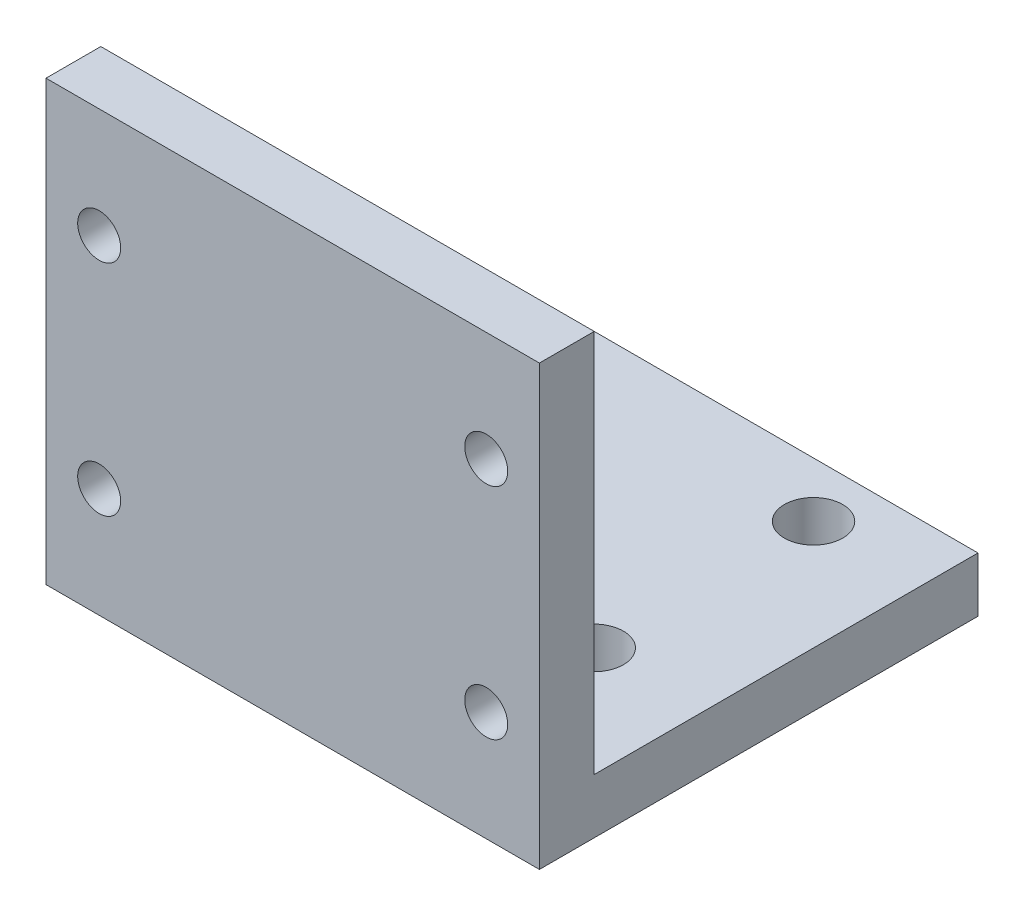
ISO-10303-21;
HEADER;
FILE_DESCRIPTION(('STEP AP214'),'2;1');
FILE_NAME('part.step','',(''),(''),'','','');
FILE_SCHEMA(('AUTOMOTIVE_DESIGN { 1 0 10303 214 1 1 1 1 }'));
ENDSEC;
DATA;
#1=APPLICATION_CONTEXT('core data for automotive mechanical design processes');
#2=APPLICATION_PROTOCOL_DEFINITION('international standard','automotive_design',2000,#1);
#3=PRODUCT_CONTEXT('',#1,'mechanical');
#4=PRODUCT('Part','Part','',(#3));
#5=PRODUCT_RELATED_PRODUCT_CATEGORY('part','',(#4));
#6=PRODUCT_DEFINITION_FORMATION('','',#4);
#7=PRODUCT_DEFINITION_CONTEXT('part definition',#1,'design');
#8=PRODUCT_DEFINITION('design','',#6,#7);
#9=PRODUCT_DEFINITION_SHAPE('','',#8);
#10=(LENGTH_UNIT() NAMED_UNIT(*) SI_UNIT(.MILLI.,.METRE.));
#11=(NAMED_UNIT(*) PLANE_ANGLE_UNIT() SI_UNIT($,.RADIAN.));
#12=(NAMED_UNIT(*) SI_UNIT($,.STERADIAN.) SOLID_ANGLE_UNIT());
#13=UNCERTAINTY_MEASURE_WITH_UNIT(LENGTH_MEASURE(1.E-05),#10,'distance_accuracy_value','');
#14=(GEOMETRIC_REPRESENTATION_CONTEXT(3) GLOBAL_UNCERTAINTY_ASSIGNED_CONTEXT((#13)) GLOBAL_UNIT_ASSIGNED_CONTEXT((#10,
#11,#12)) REPRESENTATION_CONTEXT('',''));
#15=CARTESIAN_POINT('',(0.,0.,0.));
#16=DIRECTION('',(0.,0.,1.));
#17=DIRECTION('',(1.,0.,0.));
#18=AXIS2_PLACEMENT_3D('',#15,#16,#17);
#19=CARTESIAN_POINT('',(57.15,0.,-50.8));
#20=DIRECTION('',(0.,1.,0.));
#21=DIRECTION('',(0.,0.,1.));
#22=AXIS2_PLACEMENT_3D('',#19,#20,#21);
#23=PLANE('',#22);
#24=CARTESIAN_POINT('',(44.45,0.,-19.05));
#25=DIRECTION('',(0.,1.,0.));
#26=DIRECTION('',(0.,0.,1.));
#27=AXIS2_PLACEMENT_3D('',#24,#25,#26);
#28=CIRCLE('',#27,3.3782);
#29=CARTESIAN_POINT('',(44.45,0.,-15.6718));
#30=VERTEX_POINT('',#29);
#31=EDGE_CURVE('E163',#30,#30,#28,.T.);
#32=ORIENTED_EDGE('',*,*,#31,.T.);
#33=EDGE_LOOP('',(#32));
#34=FACE_BOUND('',#33,.T.);
#35=CARTESIAN_POINT('',(44.45,0.,-44.45));
#36=DIRECTION('',(0.,1.,0.));
#37=DIRECTION('',(0.,0.,1.));
#38=AXIS2_PLACEMENT_3D('',#35,#36,#37);
#39=CIRCLE('',#38,3.3782);
#40=CARTESIAN_POINT('',(44.45,0.,-41.0718));
#41=VERTEX_POINT('',#40);
#42=EDGE_CURVE('E167',#41,#41,#39,.T.);
#43=ORIENTED_EDGE('',*,*,#42,.T.);
#44=EDGE_LOOP('',(#43));
#45=FACE_BOUND('',#44,.T.);
#46=CARTESIAN_POINT('',(12.7,0.,-44.45));
#47=DIRECTION('',(0.,1.,0.));
#48=DIRECTION('',(0.,0.,1.));
#49=AXIS2_PLACEMENT_3D('',#46,#47,#48);
#50=CIRCLE('',#49,3.3782);
#51=CARTESIAN_POINT('',(12.7,0.,-41.0718));
#52=VERTEX_POINT('',#51);
#53=EDGE_CURVE('E171',#52,#52,#50,.T.);
#54=ORIENTED_EDGE('',*,*,#53,.T.);
#55=EDGE_LOOP('',(#54));
#56=FACE_BOUND('',#55,.T.);
#57=CARTESIAN_POINT('',(12.7,0.,-19.05));
#58=DIRECTION('',(0.,1.,0.));
#59=DIRECTION('',(0.,0.,1.));
#60=AXIS2_PLACEMENT_3D('',#57,#58,#59);
#61=CIRCLE('',#60,3.3782);
#62=CARTESIAN_POINT('',(12.7,0.,-15.6718));
#63=VERTEX_POINT('',#62);
#64=EDGE_CURVE('E174',#63,#63,#61,.T.);
#65=ORIENTED_EDGE('',*,*,#64,.T.);
#66=EDGE_LOOP('',(#65));
#67=FACE_BOUND('',#66,.T.);
#68=DIRECTION('',(0.,0.,-1.));
#69=VECTOR('',#68,1.);
#70=CARTESIAN_POINT('',(0.,0.,-50.8));
#71=LINE('',#70,#69);
#72=CARTESIAN_POINT('',(0.,0.,0.));
#73=VERTEX_POINT('',#72);
#74=CARTESIAN_POINT('',(0.,0.,-50.8));
#75=VERTEX_POINT('',#74);
#76=EDGE_CURVE('E117',#73,#75,#71,.T.);
#77=ORIENTED_EDGE('',*,*,#76,.T.);
#78=DIRECTION('',(-1.,0.,0.));
#79=VECTOR('',#78,1.);
#80=CARTESIAN_POINT('',(57.15,0.,-50.8));
#81=LINE('',#80,#79);
#82=CARTESIAN_POINT('',(57.15,0.,-50.8));
#83=VERTEX_POINT('',#82);
#84=EDGE_CURVE('E11',#83,#75,#81,.T.);
#85=ORIENTED_EDGE('',*,*,#84,.F.);
#86=DIRECTION('',(0.,0.,-1.));
#87=VECTOR('',#86,1.);
#88=CARTESIAN_POINT('',(57.15,0.,-50.8));
#89=LINE('',#88,#87);
#90=CARTESIAN_POINT('',(57.15,0.,0.));
#91=VERTEX_POINT('',#90);
#92=EDGE_CURVE('E128',#91,#83,#89,.T.);
#93=ORIENTED_EDGE('',*,*,#92,.F.);
#94=DIRECTION('',(-1.,0.,0.));
#95=VECTOR('',#94,1.);
#96=CARTESIAN_POINT('',(57.15,0.,0.));
#97=LINE('',#96,#95);
#98=EDGE_CURVE('E113',#91,#73,#97,.T.);
#99=ORIENTED_EDGE('',*,*,#98,.T.);
#100=EDGE_LOOP('',(#77,#85,#93,#99));
#101=FACE_BOUND('',#100,.T.);
#102=ADVANCED_FACE('F33',(#34,#45,#56,#67,#101),#23,.F.);
#103=CARTESIAN_POINT('',(57.15,6.34999999999999,-50.8));
#104=DIRECTION('',(0.,0.,1.));
#105=DIRECTION('',(1.,0.,0.));
#106=AXIS2_PLACEMENT_3D('',#103,#104,#105);
#107=PLANE('',#106);
#108=DIRECTION('',(0.,1.,0.));
#109=VECTOR('',#108,1.);
#110=CARTESIAN_POINT('',(0.,6.34999999999999,-50.8));
#111=LINE('',#110,#109);
#112=CARTESIAN_POINT('',(0.,6.34999999999999,-50.8));
#113=VERTEX_POINT('',#112);
#114=EDGE_CURVE('E120',#75,#113,#111,.T.);
#115=ORIENTED_EDGE('',*,*,#114,.T.);
#116=DIRECTION('',(-1.,0.,0.));
#117=VECTOR('',#116,1.);
#118=CARTESIAN_POINT('',(57.15,6.34999999999999,-50.8));
#119=LINE('',#118,#117);
#120=CARTESIAN_POINT('',(57.15,6.34999999999999,-50.8));
#121=VERTEX_POINT('',#120);
#122=EDGE_CURVE('E41',#121,#113,#119,.T.);
#123=ORIENTED_EDGE('',*,*,#122,.F.);
#124=DIRECTION('',(0.,1.,0.));
#125=VECTOR('',#124,1.);
#126=CARTESIAN_POINT('',(57.15,6.34999999999999,-50.8));
#127=LINE('',#126,#125);
#128=EDGE_CURVE('E86',#83,#121,#127,.T.);
#129=ORIENTED_EDGE('',*,*,#128,.F.);
#130=ORIENTED_EDGE('',*,*,#84,.T.);
#131=EDGE_LOOP('',(#115,#123,#129,#130));
#132=FACE_BOUND('',#131,.T.);
#133=ADVANCED_FACE('F155',(#132),#107,.F.);
#134=CARTESIAN_POINT('',(57.15,6.35,-6.35000000000001));
#135=DIRECTION('',(0.,-1.,0.));
#136=DIRECTION('',(0.,0.,-1.));
#137=AXIS2_PLACEMENT_3D('',#134,#135,#136);
#138=PLANE('',#137);
#139=CARTESIAN_POINT('',(44.45,6.35,-19.05));
#140=DIRECTION('',(0.,1.,0.));
#141=DIRECTION('',(0.,0.,1.));
#142=AXIS2_PLACEMENT_3D('',#139,#140,#141);
#143=CIRCLE('',#142,3.3782);
#144=CARTESIAN_POINT('',(44.45,6.35,-15.6718));
#145=VERTEX_POINT('',#144);
#146=EDGE_CURVE('E250',#145,#145,#143,.T.);
#147=ORIENTED_EDGE('',*,*,#146,.F.);
#148=EDGE_LOOP('',(#147));
#149=FACE_BOUND('',#148,.T.);
#150=CARTESIAN_POINT('',(44.45,6.34999999999999,-44.45));
#151=DIRECTION('',(0.,1.,0.));
#152=DIRECTION('',(0.,0.,1.));
#153=AXIS2_PLACEMENT_3D('',#150,#151,#152);
#154=CIRCLE('',#153,3.3782);
#155=CARTESIAN_POINT('',(44.45,6.34999999999999,-41.0718));
#156=VERTEX_POINT('',#155);
#157=EDGE_CURVE('E253',#156,#156,#154,.T.);
#158=ORIENTED_EDGE('',*,*,#157,.F.);
#159=EDGE_LOOP('',(#158));
#160=FACE_BOUND('',#159,.T.);
#161=CARTESIAN_POINT('',(12.7,6.34999999999999,-44.45));
#162=DIRECTION('',(0.,1.,0.));
#163=DIRECTION('',(0.,0.,1.));
#164=AXIS2_PLACEMENT_3D('',#161,#162,#163);
#165=CIRCLE('',#164,3.3782);
#166=CARTESIAN_POINT('',(12.7,6.34999999999999,-41.0718));
#167=VERTEX_POINT('',#166);
#168=EDGE_CURVE('E185',#167,#167,#165,.T.);
#169=ORIENTED_EDGE('',*,*,#168,.F.);
#170=EDGE_LOOP('',(#169));
#171=FACE_BOUND('',#170,.T.);
#172=CARTESIAN_POINT('',(12.7,6.35,-19.05));
#173=DIRECTION('',(0.,1.,0.));
#174=DIRECTION('',(0.,0.,1.));
#175=AXIS2_PLACEMENT_3D('',#172,#173,#174);
#176=CIRCLE('',#175,3.3782);
#177=CARTESIAN_POINT('',(12.7,6.35,-15.6718));
#178=VERTEX_POINT('',#177);
#179=EDGE_CURVE('E177',#178,#178,#176,.T.);
#180=ORIENTED_EDGE('',*,*,#179,.F.);
#181=EDGE_LOOP('',(#180));
#182=FACE_BOUND('',#181,.T.);
#183=DIRECTION('',(0.,0.,1.));
#184=VECTOR('',#183,1.);
#185=CARTESIAN_POINT('',(0.,6.35,-6.35000000000001));
#186=LINE('',#185,#184);
#187=CARTESIAN_POINT('',(0.,6.35,-6.35000000000001));
#188=VERTEX_POINT('',#187);
#189=EDGE_CURVE('E123',#113,#188,#186,.T.);
#190=ORIENTED_EDGE('',*,*,#189,.T.);
#191=DIRECTION('',(-1.,0.,0.));
#192=VECTOR('',#191,1.);
#193=CARTESIAN_POINT('',(57.15,6.35,-6.35000000000001));
#194=LINE('',#193,#192);
#195=CARTESIAN_POINT('',(57.15,6.35,-6.35000000000001));
#196=VERTEX_POINT('',#195);
#197=EDGE_CURVE('E108',#196,#188,#194,.T.);
#198=ORIENTED_EDGE('',*,*,#197,.F.);
#199=DIRECTION('',(0.,0.,1.));
#200=VECTOR('',#199,1.);
#201=CARTESIAN_POINT('',(57.15,6.35,-6.35000000000001));
#202=LINE('',#201,#200);
#203=EDGE_CURVE('E99',#121,#196,#202,.T.);
#204=ORIENTED_EDGE('',*,*,#203,.F.);
#205=ORIENTED_EDGE('',*,*,#122,.T.);
#206=EDGE_LOOP('',(#190,#198,#204,#205));
#207=FACE_BOUND('',#206,.T.);
#208=ADVANCED_FACE('F134',(#149,#160,#171,#182,#207),#138,.F.);
#209=CARTESIAN_POINT('',(57.15,50.8,-6.34999999999999));
#210=DIRECTION('',(0.,0.,1.));
#211=DIRECTION('',(0.,-1.,0.));
#212=AXIS2_PLACEMENT_3D('',#209,#210,#211);
#213=PLANE('',#212);
#214=CARTESIAN_POINT('',(6.15950000000001,12.7,-6.35000000000001));
#215=DIRECTION('',(0.,0.,1.));
#216=DIRECTION('',(0.,-1.,0.));
#217=AXIS2_PLACEMENT_3D('',#214,#215,#216);
#218=CIRCLE('',#217,2.4892);
#219=CARTESIAN_POINT('',(6.15950000000001,10.2108,-6.35000000000001));
#220=VERTEX_POINT('',#219);
#221=EDGE_CURVE('E180',#220,#220,#218,.T.);
#222=ORIENTED_EDGE('',*,*,#221,.T.);
#223=EDGE_LOOP('',(#222));
#224=FACE_BOUND('',#223,.T.);
#225=CARTESIAN_POINT('',(50.9905,12.7,-6.35000000000001));
#226=DIRECTION('',(0.,0.,1.));
#227=DIRECTION('',(0.,-1.,0.));
#228=AXIS2_PLACEMENT_3D('',#225,#226,#227);
#229=CIRCLE('',#228,2.4892);
#230=CARTESIAN_POINT('',(50.9905,10.2108,-6.35000000000001));
#231=VERTEX_POINT('',#230);
#232=EDGE_CURVE('E193',#231,#231,#229,.T.);
#233=ORIENTED_EDGE('',*,*,#232,.T.);
#234=EDGE_LOOP('',(#233));
#235=FACE_BOUND('',#234,.T.);
#236=CARTESIAN_POINT('',(50.9905,38.1,-6.35));
#237=DIRECTION('',(0.,0.,1.));
#238=DIRECTION('',(0.,-1.,0.));
#239=AXIS2_PLACEMENT_3D('',#236,#237,#238);
#240=CIRCLE('',#239,2.4892);
#241=CARTESIAN_POINT('',(50.9905,35.6108,-6.35));
#242=VERTEX_POINT('',#241);
#243=EDGE_CURVE('E199',#242,#242,#240,.T.);
#244=ORIENTED_EDGE('',*,*,#243,.T.);
#245=EDGE_LOOP('',(#244));
#246=FACE_BOUND('',#245,.T.);
#247=CARTESIAN_POINT('',(6.1595,38.1,-6.35));
#248=DIRECTION('',(0.,0.,1.));
#249=DIRECTION('',(0.,-1.,0.));
#250=AXIS2_PLACEMENT_3D('',#247,#248,#249);
#251=CIRCLE('',#250,2.4892);
#252=CARTESIAN_POINT('',(6.1595,35.6108,-6.35));
#253=VERTEX_POINT('',#252);
#254=EDGE_CURVE('E121',#253,#253,#251,.T.);
#255=ORIENTED_EDGE('',*,*,#254,.T.);
#256=EDGE_LOOP('',(#255));
#257=FACE_BOUND('',#256,.T.);
#258=DIRECTION('',(0.,1.,0.));
#259=VECTOR('',#258,1.);
#260=CARTESIAN_POINT('',(0.,50.8,-6.34999999999999));
#261=LINE('',#260,#259);
#262=CARTESIAN_POINT('',(0.,50.8,-6.34999999999999));
#263=VERTEX_POINT('',#262);
#264=EDGE_CURVE('E107',#188,#263,#261,.T.);
#265=ORIENTED_EDGE('',*,*,#264,.T.);
#266=DIRECTION('',(-1.,0.,0.));
#267=VECTOR('',#266,1.);
#268=CARTESIAN_POINT('',(57.15,50.8,-6.34999999999999));
#269=LINE('',#268,#267);
#270=CARTESIAN_POINT('',(57.15,50.8,-6.34999999999999));
#271=VERTEX_POINT('',#270);
#272=EDGE_CURVE('E104',#271,#263,#269,.T.);
#273=ORIENTED_EDGE('',*,*,#272,.F.);
#274=DIRECTION('',(0.,1.,0.));
#275=VECTOR('',#274,1.);
#276=CARTESIAN_POINT('',(57.15,50.8,-6.34999999999999));
#277=LINE('',#276,#275);
#278=EDGE_CURVE('E93',#196,#271,#277,.T.);
#279=ORIENTED_EDGE('',*,*,#278,.F.);
#280=ORIENTED_EDGE('',*,*,#197,.T.);
#281=EDGE_LOOP('',(#265,#273,#279,#280));
#282=FACE_BOUND('',#281,.T.);
#283=ADVANCED_FACE('F105',(#224,#235,#246,#257,#282),#213,.F.);
#284=CARTESIAN_POINT('',(57.15,50.8,0.));
#285=DIRECTION('',(0.,-1.,0.));
#286=DIRECTION('',(0.,0.,-1.));
#287=AXIS2_PLACEMENT_3D('',#284,#285,#286);
#288=PLANE('',#287);
#289=DIRECTION('',(0.,0.,1.));
#290=VECTOR('',#289,1.);
#291=CARTESIAN_POINT('',(0.,50.8,0.));
#292=LINE('',#291,#290);
#293=CARTESIAN_POINT('',(0.,50.8,0.));
#294=VERTEX_POINT('',#293);
#295=EDGE_CURVE('E72',#263,#294,#292,.T.);
#296=ORIENTED_EDGE('',*,*,#295,.T.);
#297=DIRECTION('',(-1.,0.,0.));
#298=VECTOR('',#297,1.);
#299=CARTESIAN_POINT('',(57.15,50.8,0.));
#300=LINE('',#299,#298);
#301=CARTESIAN_POINT('',(57.15,50.8,0.));
#302=VERTEX_POINT('',#301);
#303=EDGE_CURVE('E109',#302,#294,#300,.T.);
#304=ORIENTED_EDGE('',*,*,#303,.F.);
#305=DIRECTION('',(0.,0.,1.));
#306=VECTOR('',#305,1.);
#307=CARTESIAN_POINT('',(57.15,50.8,0.));
#308=LINE('',#307,#306);
#309=EDGE_CURVE('E97',#271,#302,#308,.T.);
#310=ORIENTED_EDGE('',*,*,#309,.F.);
#311=ORIENTED_EDGE('',*,*,#272,.T.);
#312=EDGE_LOOP('',(#296,#304,#310,#311));
#313=FACE_BOUND('',#312,.T.);
#314=ADVANCED_FACE('F111',(#313),#288,.F.);
#315=CARTESIAN_POINT('',(57.15,0.,0.));
#316=DIRECTION('',(0.,0.,-1.));
#317=DIRECTION('',(0.,1.,0.));
#318=AXIS2_PLACEMENT_3D('',#315,#316,#317);
#319=PLANE('',#318);
#320=CARTESIAN_POINT('',(6.15950000000001,12.7,0.));
#321=DIRECTION('',(0.,0.,1.));
#322=DIRECTION('',(1.,0.,0.));
#323=AXIS2_PLACEMENT_3D('',#320,#321,#322);
#324=CIRCLE('',#323,2.4892);
#325=CARTESIAN_POINT('',(8.64870000000001,12.7,0.));
#326=VERTEX_POINT('',#325);
#327=EDGE_CURVE('E176',#326,#326,#324,.T.);
#328=ORIENTED_EDGE('',*,*,#327,.F.);
#329=EDGE_LOOP('',(#328));
#330=FACE_BOUND('',#329,.T.);
#331=CARTESIAN_POINT('',(50.9905,12.7,0.));
#332=DIRECTION('',(0.,0.,1.));
#333=DIRECTION('',(1.,0.,0.));
#334=AXIS2_PLACEMENT_3D('',#331,#332,#333);
#335=CIRCLE('',#334,2.4892);
#336=CARTESIAN_POINT('',(53.4797,12.7,0.));
#337=VERTEX_POINT('',#336);
#338=EDGE_CURVE('E190',#337,#337,#335,.T.);
#339=ORIENTED_EDGE('',*,*,#338,.F.);
#340=EDGE_LOOP('',(#339));
#341=FACE_BOUND('',#340,.T.);
#342=CARTESIAN_POINT('',(50.9905,38.1,0.));
#343=DIRECTION('',(0.,0.,1.));
#344=DIRECTION('',(1.,0.,0.));
#345=AXIS2_PLACEMENT_3D('',#342,#343,#344);
#346=CIRCLE('',#345,2.4892);
#347=CARTESIAN_POINT('',(53.4797,38.1,0.));
#348=VERTEX_POINT('',#347);
#349=EDGE_CURVE('E196',#348,#348,#346,.T.);
#350=ORIENTED_EDGE('',*,*,#349,.F.);
#351=EDGE_LOOP('',(#350));
#352=FACE_BOUND('',#351,.T.);
#353=CARTESIAN_POINT('',(6.1595,38.1,0.));
#354=DIRECTION('',(0.,0.,1.));
#355=DIRECTION('',(1.,0.,0.));
#356=AXIS2_PLACEMENT_3D('',#353,#354,#355);
#357=CIRCLE('',#356,2.4892);
#358=CARTESIAN_POINT('',(8.64870000000001,38.1,0.));
#359=VERTEX_POINT('',#358);
#360=EDGE_CURVE('E202',#359,#359,#357,.T.);
#361=ORIENTED_EDGE('',*,*,#360,.F.);
#362=EDGE_LOOP('',(#361));
#363=FACE_BOUND('',#362,.T.);
#364=DIRECTION('',(0.,-1.,0.));
#365=VECTOR('',#364,1.);
#366=CARTESIAN_POINT('',(0.,0.,0.));
#367=LINE('',#366,#365);
#368=EDGE_CURVE('E78',#294,#73,#367,.T.);
#369=ORIENTED_EDGE('',*,*,#368,.T.);
#370=ORIENTED_EDGE('',*,*,#98,.F.);
#371=DIRECTION('',(0.,-1.,0.));
#372=VECTOR('',#371,1.);
#373=CARTESIAN_POINT('',(57.15,0.,0.));
#374=LINE('',#373,#372);
#375=EDGE_CURVE('E49',#302,#91,#374,.T.);
#376=ORIENTED_EDGE('',*,*,#375,.F.);
#377=ORIENTED_EDGE('',*,*,#303,.T.);
#378=EDGE_LOOP('',(#369,#370,#376,#377));
#379=FACE_BOUND('',#378,.T.);
#380=ADVANCED_FACE('F141',(#330,#341,#352,#363,#379),#319,.F.);
#381=CARTESIAN_POINT('',(57.15,0.,0.));
#382=DIRECTION('',(-1.,0.,0.));
#383=DIRECTION('',(0.,0.,1.));
#384=AXIS2_PLACEMENT_3D('',#381,#382,#383);
#385=PLANE('',#384);
#386=ORIENTED_EDGE('',*,*,#92,.T.);
#387=ORIENTED_EDGE('',*,*,#128,.T.);
#388=ORIENTED_EDGE('',*,*,#203,.T.);
#389=ORIENTED_EDGE('',*,*,#278,.T.);
#390=ORIENTED_EDGE('',*,*,#309,.T.);
#391=ORIENTED_EDGE('',*,*,#375,.T.);
#392=EDGE_LOOP('',(#386,#387,#388,#389,#390,#391));
#393=FACE_BOUND('',#392,.T.);
#394=ADVANCED_FACE('F95',(#393),#385,.F.);
#395=CARTESIAN_POINT('',(0.,0.,0.));
#396=DIRECTION('',(-1.,0.,0.));
#397=DIRECTION('',(0.,0.,1.));
#398=AXIS2_PLACEMENT_3D('',#395,#396,#397);
#399=PLANE('',#398);
#400=ORIENTED_EDGE('',*,*,#76,.F.);
#401=ORIENTED_EDGE('',*,*,#368,.F.);
#402=ORIENTED_EDGE('',*,*,#295,.F.);
#403=ORIENTED_EDGE('',*,*,#264,.F.);
#404=ORIENTED_EDGE('',*,*,#189,.F.);
#405=ORIENTED_EDGE('',*,*,#114,.F.);
#406=EDGE_LOOP('',(#400,#401,#402,#403,#404,#405));
#407=FACE_BOUND('',#406,.T.);
#408=ADVANCED_FACE('F137',(#407),#399,.T.);
#409=CARTESIAN_POINT('',(6.1595,38.1,-50.8));
#410=DIRECTION('',(0.,0.,1.));
#411=DIRECTION('',(1.,0.,0.));
#412=AXIS2_PLACEMENT_3D('',#409,#410,#411);
#413=CYLINDRICAL_SURFACE('',#412,2.4892);
#414=ORIENTED_EDGE('',*,*,#360,.T.);
#415=EDGE_LOOP('',(#414));
#416=FACE_BOUND('',#415,.T.);
#417=ORIENTED_EDGE('',*,*,#254,.F.);
#418=EDGE_LOOP('',(#417));
#419=FACE_BOUND('',#418,.T.);
#420=ADVANCED_FACE('F211',(#416,#419),#413,.F.);
#421=CARTESIAN_POINT('',(50.9905,38.1,-50.8));
#422=DIRECTION('',(0.,0.,1.));
#423=DIRECTION('',(1.,0.,0.));
#424=AXIS2_PLACEMENT_3D('',#421,#422,#423);
#425=CYLINDRICAL_SURFACE('',#424,2.4892);
#426=ORIENTED_EDGE('',*,*,#349,.T.);
#427=EDGE_LOOP('',(#426));
#428=FACE_BOUND('',#427,.T.);
#429=ORIENTED_EDGE('',*,*,#243,.F.);
#430=EDGE_LOOP('',(#429));
#431=FACE_BOUND('',#430,.T.);
#432=ADVANCED_FACE('F213',(#428,#431),#425,.F.);
#433=CARTESIAN_POINT('',(50.9905,12.7,-50.8));
#434=DIRECTION('',(0.,0.,1.));
#435=DIRECTION('',(1.,0.,0.));
#436=AXIS2_PLACEMENT_3D('',#433,#434,#435);
#437=CYLINDRICAL_SURFACE('',#436,2.4892);
#438=ORIENTED_EDGE('',*,*,#338,.T.);
#439=EDGE_LOOP('',(#438));
#440=FACE_BOUND('',#439,.T.);
#441=ORIENTED_EDGE('',*,*,#232,.F.);
#442=EDGE_LOOP('',(#441));
#443=FACE_BOUND('',#442,.T.);
#444=ADVANCED_FACE('F220',(#440,#443),#437,.F.);
#445=CARTESIAN_POINT('',(6.15950000000001,12.7,-50.8));
#446=DIRECTION('',(0.,0.,1.));
#447=DIRECTION('',(1.,0.,0.));
#448=AXIS2_PLACEMENT_3D('',#445,#446,#447);
#449=CYLINDRICAL_SURFACE('',#448,2.4892);
#450=ORIENTED_EDGE('',*,*,#327,.T.);
#451=EDGE_LOOP('',(#450));
#452=FACE_BOUND('',#451,.T.);
#453=ORIENTED_EDGE('',*,*,#221,.F.);
#454=EDGE_LOOP('',(#453));
#455=FACE_BOUND('',#454,.T.);
#456=ADVANCED_FACE('F226',(#452,#455),#449,.F.);
#457=CARTESIAN_POINT('',(12.7,0.,-19.05));
#458=DIRECTION('',(0.,1.,0.));
#459=DIRECTION('',(0.,0.,1.));
#460=AXIS2_PLACEMENT_3D('',#457,#458,#459);
#461=CYLINDRICAL_SURFACE('',#460,3.3782);
#462=CARTESIAN_POINT('',(12.7,0.,-15.6718));
#463=CARTESIAN_POINT('',(12.7,0.0661458333333244,-15.6718));
#464=CARTESIAN_POINT('',(12.7,0.132291666666658,-15.6718));
#465=CARTESIAN_POINT('',(12.7,0.264583333333325,-15.6718));
#466=CARTESIAN_POINT('',(12.7,0.330729166666658,-15.6718));
#467=CARTESIAN_POINT('',(12.7,0.463020833333325,-15.6718));
#468=CARTESIAN_POINT('',(12.7,0.529166666666658,-15.6718));
#469=CARTESIAN_POINT('',(12.7,0.661458333333325,-15.6718));
#470=CARTESIAN_POINT('',(12.7,0.727604166666659,-15.6718));
#471=CARTESIAN_POINT('',(12.7,0.859895833333325,-15.6718));
#472=CARTESIAN_POINT('',(12.7,0.926041666666659,-15.6718));
#473=CARTESIAN_POINT('',(12.7,1.05833333333333,-15.6718));
#474=CARTESIAN_POINT('',(12.7,1.12447916666666,-15.6718));
#475=CARTESIAN_POINT('',(12.7,1.25677083333333,-15.6718));
#476=CARTESIAN_POINT('',(12.7,1.32291666666666,-15.6718));
#477=CARTESIAN_POINT('',(12.7,1.45520833333333,-15.6718));
#478=CARTESIAN_POINT('',(12.7,1.52135416666666,-15.6718));
#479=CARTESIAN_POINT('',(12.7,1.65364583333333,-15.6718));
#480=CARTESIAN_POINT('',(12.7,1.71979166666666,-15.6718));
#481=CARTESIAN_POINT('',(12.7,1.85208333333333,-15.6718));
#482=CARTESIAN_POINT('',(12.7,1.91822916666666,-15.6718));
#483=CARTESIAN_POINT('',(12.7,2.05052083333333,-15.6718));
#484=CARTESIAN_POINT('',(12.7,2.11666666666666,-15.6718));
#485=CARTESIAN_POINT('',(12.7,2.24895833333333,-15.6718));
#486=CARTESIAN_POINT('',(12.7,2.31510416666666,-15.6718));
#487=CARTESIAN_POINT('',(12.7,2.44739583333333,-15.6718));
#488=CARTESIAN_POINT('',(12.7,2.51354166666666,-15.6718));
#489=CARTESIAN_POINT('',(12.7,2.64583333333333,-15.6718));
#490=CARTESIAN_POINT('',(12.7,2.71197916666666,-15.6718));
#491=CARTESIAN_POINT('',(12.7,2.84427083333333,-15.6718));
#492=CARTESIAN_POINT('',(12.7,2.91041666666666,-15.6718));
#493=CARTESIAN_POINT('',(12.7,3.04270833333333,-15.6718));
#494=CARTESIAN_POINT('',(12.7,3.10885416666666,-15.6718));
#495=CARTESIAN_POINT('',(12.7,3.24114583333333,-15.6718));
#496=CARTESIAN_POINT('',(12.7,3.30729166666666,-15.6718));
#497=CARTESIAN_POINT('',(12.7,3.43958333333333,-15.6718));
#498=CARTESIAN_POINT('',(12.7,3.50572916666666,-15.6718));
#499=CARTESIAN_POINT('',(12.7,3.63802083333333,-15.6718));
#500=CARTESIAN_POINT('',(12.7,3.70416666666666,-15.6718));
#501=CARTESIAN_POINT('',(12.7,3.83645833333333,-15.6718));
#502=CARTESIAN_POINT('',(12.7,3.90260416666666,-15.6718));
#503=CARTESIAN_POINT('',(12.7,4.03489583333333,-15.6718));
#504=CARTESIAN_POINT('',(12.7,4.10104166666666,-15.6718));
#505=CARTESIAN_POINT('',(12.7,4.23333333333333,-15.6718));
#506=CARTESIAN_POINT('',(12.7,4.29947916666666,-15.6718));
#507=CARTESIAN_POINT('',(12.7,4.43177083333333,-15.6718));
#508=CARTESIAN_POINT('',(12.7,4.49791666666666,-15.6718));
#509=CARTESIAN_POINT('',(12.7,4.63020833333333,-15.6718));
#510=CARTESIAN_POINT('',(12.7,4.69635416666666,-15.6718));
#511=CARTESIAN_POINT('',(12.7,4.82864583333333,-15.6718));
#512=CARTESIAN_POINT('',(12.7,4.89479166666666,-15.6718));
#513=CARTESIAN_POINT('',(12.7,5.02708333333333,-15.6718));
#514=CARTESIAN_POINT('',(12.7,5.09322916666666,-15.6718));
#515=CARTESIAN_POINT('',(12.7,5.22552083333333,-15.6718));
#516=CARTESIAN_POINT('',(12.7,5.29166666666666,-15.6718));
#517=CARTESIAN_POINT('',(12.7,5.42395833333333,-15.6718));
#518=CARTESIAN_POINT('',(12.7,5.49010416666666,-15.6718));
#519=CARTESIAN_POINT('',(12.7,5.62239583333333,-15.6718));
#520=CARTESIAN_POINT('',(12.7,5.68854166666666,-15.6718));
#521=CARTESIAN_POINT('',(12.7,5.82083333333333,-15.6718));
#522=CARTESIAN_POINT('',(12.7,5.88697916666667,-15.6718));
#523=CARTESIAN_POINT('',(12.7,6.01927083333333,-15.6718));
#524=CARTESIAN_POINT('',(12.7,6.08541666666667,-15.6718));
#525=CARTESIAN_POINT('',(12.7,6.21770833333333,-15.6718));
#526=CARTESIAN_POINT('',(12.7,6.28385416666667,-15.6718));
#527=CARTESIAN_POINT('',(12.7,6.35,-15.6718));
#528=B_SPLINE_CURVE_WITH_KNOTS('',3,(#462,#463,#464,#465,#466,#467,#468,#469,#470,#471,#472,
#473,#474,#475,#476,#477,#478,#479,#480,#481,#482,#483,#484,#485,#486,#487,#488,#489,#490,#491,
#492,#493,#494,#495,#496,#497,#498,#499,#500,#501,#502,#503,#504,#505,#506,#507,#508,#509,#510,
#511,#512,#513,#514,#515,#516,#517,#518,#519,#520,#521,#522,#523,#524,#525,#526,#527),
.UNSPECIFIED.,.F.,.F.,(4,2,2,2,2,2,2,2,2,2,2,2,2,2,2,2,2,2,2,2,2,2,2,2,2,2,2,2,2,2,2,2,4),(0.,
0.1984375,0.396875,0.595312500000001,0.793750000000001,0.992187500000001,1.190625,1.3890625,
1.5875,1.7859375,1.984375,2.1828125,2.38125,2.5796875,2.778125,2.9765625,3.175,3.3734375,
3.571875,3.7703125,3.96875,4.16718750000001,4.365625,4.5640625,4.76250000000001,
4.96093750000001,5.15937500000001,5.35781250000001,5.55625000000001,5.75468750000001,
5.95312500000001,6.15156250000001,6.35000000000001),.UNSPECIFIED.);
#529=EDGE_CURVE('BSEAM230',#63,#178,#528,.T.);
#530=ORIENTED_EDGE('',*,*,#64,.F.);
#531=ORIENTED_EDGE('',*,*,#179,.T.);
#532=ORIENTED_EDGE('',*,*,#529,.T.);
#533=ORIENTED_EDGE('',*,*,#529,.F.);
#534=EDGE_LOOP('',(#530,#532,#531,#533));
#535=FACE_BOUND('',#534,.T.);
#536=ADVANCED_FACE('F230',(#535),#461,.F.);
#537=CARTESIAN_POINT('',(12.7,0.,-44.45));
#538=DIRECTION('',(0.,1.,0.));
#539=DIRECTION('',(0.,0.,1.));
#540=AXIS2_PLACEMENT_3D('',#537,#538,#539);
#541=CYLINDRICAL_SURFACE('',#540,3.3782);
#542=CARTESIAN_POINT('',(12.7,0.,-41.0718));
#543=CARTESIAN_POINT('',(12.7,0.06614583333332,-41.0718));
#544=CARTESIAN_POINT('',(12.7,0.132291666666654,-41.0718));
#545=CARTESIAN_POINT('',(12.7,0.26458333333332,-41.0718));
#546=CARTESIAN_POINT('',(12.7,0.330729166666654,-41.0718));
#547=CARTESIAN_POINT('',(12.7,0.463020833333321,-41.0718));
#548=CARTESIAN_POINT('',(12.7,0.529166666666654,-41.0718));
#549=CARTESIAN_POINT('',(12.7,0.661458333333321,-41.0718));
#550=CARTESIAN_POINT('',(12.7,0.727604166666654,-41.0718));
#551=CARTESIAN_POINT('',(12.7,0.859895833333321,-41.0718));
#552=CARTESIAN_POINT('',(12.7,0.926041666666654,-41.0718));
#553=CARTESIAN_POINT('',(12.7,1.05833333333332,-41.0718));
#554=CARTESIAN_POINT('',(12.7,1.12447916666665,-41.0718));
#555=CARTESIAN_POINT('',(12.7,1.25677083333332,-41.0718));
#556=CARTESIAN_POINT('',(12.7,1.32291666666665,-41.0718));
#557=CARTESIAN_POINT('',(12.7,1.45520833333332,-41.0718));
#558=CARTESIAN_POINT('',(12.7,1.52135416666666,-41.0718));
#559=CARTESIAN_POINT('',(12.7,1.65364583333332,-41.0718));
#560=CARTESIAN_POINT('',(12.7,1.71979166666666,-41.0718));
#561=CARTESIAN_POINT('',(12.7,1.85208333333332,-41.0718));
#562=CARTESIAN_POINT('',(12.7,1.91822916666666,-41.0718));
#563=CARTESIAN_POINT('',(12.7,2.05052083333332,-41.0718));
#564=CARTESIAN_POINT('',(12.7,2.11666666666666,-41.0718));
#565=CARTESIAN_POINT('',(12.7,2.24895833333332,-41.0718));
#566=CARTESIAN_POINT('',(12.7,2.31510416666666,-41.0718));
#567=CARTESIAN_POINT('',(12.7,2.44739583333332,-41.0718));
#568=CARTESIAN_POINT('',(12.7,2.51354166666666,-41.0718));
#569=CARTESIAN_POINT('',(12.7,2.64583333333332,-41.0718));
#570=CARTESIAN_POINT('',(12.7,2.71197916666666,-41.0718));
#571=CARTESIAN_POINT('',(12.7,2.84427083333332,-41.0718));
#572=CARTESIAN_POINT('',(12.7,2.91041666666666,-41.0718));
#573=CARTESIAN_POINT('',(12.7,3.04270833333332,-41.0718));
#574=CARTESIAN_POINT('',(12.7,3.10885416666666,-41.0718));
#575=CARTESIAN_POINT('',(12.7,3.24114583333332,-41.0718));
#576=CARTESIAN_POINT('',(12.7,3.30729166666666,-41.0718));
#577=CARTESIAN_POINT('',(12.7,3.43958333333332,-41.0718));
#578=CARTESIAN_POINT('',(12.7,3.50572916666666,-41.0718));
#579=CARTESIAN_POINT('',(12.7,3.63802083333332,-41.0718));
#580=CARTESIAN_POINT('',(12.7,3.70416666666666,-41.0718));
#581=CARTESIAN_POINT('',(12.7,3.83645833333332,-41.0718));
#582=CARTESIAN_POINT('',(12.7,3.90260416666666,-41.0718));
#583=CARTESIAN_POINT('',(12.7,4.03489583333333,-41.0718));
#584=CARTESIAN_POINT('',(12.7,4.10104166666666,-41.0718));
#585=CARTESIAN_POINT('',(12.7,4.23333333333333,-41.0718));
#586=CARTESIAN_POINT('',(12.7,4.29947916666666,-41.0718));
#587=CARTESIAN_POINT('',(12.7,4.43177083333333,-41.0718));
#588=CARTESIAN_POINT('',(12.7,4.49791666666666,-41.0718));
#589=CARTESIAN_POINT('',(12.7,4.63020833333333,-41.0718));
#590=CARTESIAN_POINT('',(12.7,4.69635416666666,-41.0718));
#591=CARTESIAN_POINT('',(12.7,4.82864583333333,-41.0718));
#592=CARTESIAN_POINT('',(12.7,4.89479166666666,-41.0718));
#593=CARTESIAN_POINT('',(12.7,5.02708333333333,-41.0718));
#594=CARTESIAN_POINT('',(12.7,5.09322916666666,-41.0718));
#595=CARTESIAN_POINT('',(12.7,5.22552083333333,-41.0718));
#596=CARTESIAN_POINT('',(12.7,5.29166666666666,-41.0718));
#597=CARTESIAN_POINT('',(12.7,5.42395833333333,-41.0718));
#598=CARTESIAN_POINT('',(12.7,5.49010416666666,-41.0718));
#599=CARTESIAN_POINT('',(12.7,5.62239583333333,-41.0718));
#600=CARTESIAN_POINT('',(12.7,5.68854166666666,-41.0718));
#601=CARTESIAN_POINT('',(12.7,5.82083333333333,-41.0718));
#602=CARTESIAN_POINT('',(12.7,5.88697916666666,-41.0718));
#603=CARTESIAN_POINT('',(12.7,6.01927083333333,-41.0718));
#604=CARTESIAN_POINT('',(12.7,6.08541666666666,-41.0718));
#605=CARTESIAN_POINT('',(12.7,6.21770833333333,-41.0718));
#606=CARTESIAN_POINT('',(12.7,6.28385416666666,-41.0718));
#607=CARTESIAN_POINT('',(12.7,6.34999999999999,-41.0718));
#608=B_SPLINE_CURVE_WITH_KNOTS('',3,(#542,#543,#544,#545,#546,#547,#548,#549,#550,#551,#552,
#553,#554,#555,#556,#557,#558,#559,#560,#561,#562,#563,#564,#565,#566,#567,#568,#569,#570,#571,
#572,#573,#574,#575,#576,#577,#578,#579,#580,#581,#582,#583,#584,#585,#586,#587,#588,#589,#590,
#591,#592,#593,#594,#595,#596,#597,#598,#599,#600,#601,#602,#603,#604,#605,#606,#607),
.UNSPECIFIED.,.F.,.F.,(4,2,2,2,2,2,2,2,2,2,2,2,2,2,2,2,2,2,2,2,2,2,2,2,2,2,2,2,2,2,2,2,4),(0.,
0.1984375,0.396875,0.595312500000001,0.793750000000001,0.992187500000001,1.190625,1.3890625,
1.5875,1.7859375,1.984375,2.1828125,2.38125,2.5796875,2.778125,2.9765625,3.175,3.3734375,
3.571875,3.7703125,3.96875,4.16718750000001,4.365625,4.5640625,4.76250000000001,
4.96093750000001,5.15937500000001,5.35781250000001,5.55625000000001,5.75468750000001,
5.95312500000001,6.15156250000001,6.35000000000001),.UNSPECIFIED.);
#609=EDGE_CURVE('BSEAM234',#52,#167,#608,.T.);
#610=ORIENTED_EDGE('',*,*,#53,.F.);
#611=ORIENTED_EDGE('',*,*,#168,.T.);
#612=ORIENTED_EDGE('',*,*,#609,.T.);
#613=ORIENTED_EDGE('',*,*,#609,.F.);
#614=EDGE_LOOP('',(#610,#612,#611,#613));
#615=FACE_BOUND('',#614,.T.);
#616=ADVANCED_FACE('F234',(#615),#541,.F.);
#617=CARTESIAN_POINT('',(44.45,0.,-44.45));
#618=DIRECTION('',(0.,1.,0.));
#619=DIRECTION('',(0.,0.,1.));
#620=AXIS2_PLACEMENT_3D('',#617,#618,#619);
#621=CYLINDRICAL_SURFACE('',#620,3.3782);
#622=CARTESIAN_POINT('',(44.45,0.,-41.0718));
#623=CARTESIAN_POINT('',(44.45,0.06614583333332,-41.0718));
#624=CARTESIAN_POINT('',(44.45,0.132291666666654,-41.0718));
#625=CARTESIAN_POINT('',(44.45,0.26458333333332,-41.0718));
#626=CARTESIAN_POINT('',(44.45,0.330729166666654,-41.0718));
#627=CARTESIAN_POINT('',(44.45,0.463020833333321,-41.0718));
#628=CARTESIAN_POINT('',(44.45,0.529166666666654,-41.0718));
#629=CARTESIAN_POINT('',(44.45,0.661458333333321,-41.0718));
#630=CARTESIAN_POINT('',(44.45,0.727604166666654,-41.0718));
#631=CARTESIAN_POINT('',(44.45,0.859895833333321,-41.0718));
#632=CARTESIAN_POINT('',(44.45,0.926041666666654,-41.0718));
#633=CARTESIAN_POINT('',(44.45,1.05833333333332,-41.0718));
#634=CARTESIAN_POINT('',(44.45,1.12447916666665,-41.0718));
#635=CARTESIAN_POINT('',(44.45,1.25677083333332,-41.0718));
#636=CARTESIAN_POINT('',(44.45,1.32291666666665,-41.0718));
#637=CARTESIAN_POINT('',(44.45,1.45520833333332,-41.0718));
#638=CARTESIAN_POINT('',(44.45,1.52135416666666,-41.0718));
#639=CARTESIAN_POINT('',(44.45,1.65364583333332,-41.0718));
#640=CARTESIAN_POINT('',(44.45,1.71979166666666,-41.0718));
#641=CARTESIAN_POINT('',(44.45,1.85208333333332,-41.0718));
#642=CARTESIAN_POINT('',(44.45,1.91822916666666,-41.0718));
#643=CARTESIAN_POINT('',(44.45,2.05052083333332,-41.0718));
#644=CARTESIAN_POINT('',(44.45,2.11666666666666,-41.0718));
#645=CARTESIAN_POINT('',(44.45,2.24895833333332,-41.0718));
#646=CARTESIAN_POINT('',(44.45,2.31510416666666,-41.0718));
#647=CARTESIAN_POINT('',(44.45,2.44739583333332,-41.0718));
#648=CARTESIAN_POINT('',(44.45,2.51354166666666,-41.0718));
#649=CARTESIAN_POINT('',(44.45,2.64583333333332,-41.0718));
#650=CARTESIAN_POINT('',(44.45,2.71197916666666,-41.0718));
#651=CARTESIAN_POINT('',(44.45,2.84427083333332,-41.0718));
#652=CARTESIAN_POINT('',(44.45,2.91041666666666,-41.0718));
#653=CARTESIAN_POINT('',(44.45,3.04270833333332,-41.0718));
#654=CARTESIAN_POINT('',(44.45,3.10885416666666,-41.0718));
#655=CARTESIAN_POINT('',(44.45,3.24114583333332,-41.0718));
#656=CARTESIAN_POINT('',(44.45,3.30729166666666,-41.0718));
#657=CARTESIAN_POINT('',(44.45,3.43958333333332,-41.0718));
#658=CARTESIAN_POINT('',(44.45,3.50572916666666,-41.0718));
#659=CARTESIAN_POINT('',(44.45,3.63802083333332,-41.0718));
#660=CARTESIAN_POINT('',(44.45,3.70416666666666,-41.0718));
#661=CARTESIAN_POINT('',(44.45,3.83645833333332,-41.0718));
#662=CARTESIAN_POINT('',(44.45,3.90260416666666,-41.0718));
#663=CARTESIAN_POINT('',(44.45,4.03489583333333,-41.0718));
#664=CARTESIAN_POINT('',(44.45,4.10104166666666,-41.0718));
#665=CARTESIAN_POINT('',(44.45,4.23333333333333,-41.0718));
#666=CARTESIAN_POINT('',(44.45,4.29947916666666,-41.0718));
#667=CARTESIAN_POINT('',(44.45,4.43177083333333,-41.0718));
#668=CARTESIAN_POINT('',(44.45,4.49791666666666,-41.0718));
#669=CARTESIAN_POINT('',(44.45,4.63020833333333,-41.0718));
#670=CARTESIAN_POINT('',(44.45,4.69635416666666,-41.0718));
#671=CARTESIAN_POINT('',(44.45,4.82864583333333,-41.0718));
#672=CARTESIAN_POINT('',(44.45,4.89479166666666,-41.0718));
#673=CARTESIAN_POINT('',(44.45,5.02708333333333,-41.0718));
#674=CARTESIAN_POINT('',(44.45,5.09322916666666,-41.0718));
#675=CARTESIAN_POINT('',(44.45,5.22552083333333,-41.0718));
#676=CARTESIAN_POINT('',(44.45,5.29166666666666,-41.0718));
#677=CARTESIAN_POINT('',(44.45,5.42395833333333,-41.0718));
#678=CARTESIAN_POINT('',(44.45,5.49010416666666,-41.0718));
#679=CARTESIAN_POINT('',(44.45,5.62239583333333,-41.0718));
#680=CARTESIAN_POINT('',(44.45,5.68854166666666,-41.0718));
#681=CARTESIAN_POINT('',(44.45,5.82083333333333,-41.0718));
#682=CARTESIAN_POINT('',(44.45,5.88697916666666,-41.0718));
#683=CARTESIAN_POINT('',(44.45,6.01927083333333,-41.0718));
#684=CARTESIAN_POINT('',(44.45,6.08541666666666,-41.0718));
#685=CARTESIAN_POINT('',(44.45,6.21770833333333,-41.0718));
#686=CARTESIAN_POINT('',(44.45,6.28385416666666,-41.0718));
#687=CARTESIAN_POINT('',(44.45,6.34999999999999,-41.0718));
#688=B_SPLINE_CURVE_WITH_KNOTS('',3,(#622,#623,#624,#625,#626,#627,#628,#629,#630,#631,#632,
#633,#634,#635,#636,#637,#638,#639,#640,#641,#642,#643,#644,#645,#646,#647,#648,#649,#650,#651,
#652,#653,#654,#655,#656,#657,#658,#659,#660,#661,#662,#663,#664,#665,#666,#667,#668,#669,#670,
#671,#672,#673,#674,#675,#676,#677,#678,#679,#680,#681,#682,#683,#684,#685,#686,#687),
.UNSPECIFIED.,.F.,.F.,(4,2,2,2,2,2,2,2,2,2,2,2,2,2,2,2,2,2,2,2,2,2,2,2,2,2,2,2,2,2,2,2,4),(0.,
0.1984375,0.396875,0.595312500000001,0.793750000000001,0.992187500000001,1.190625,1.3890625,
1.5875,1.7859375,1.984375,2.1828125,2.38125,2.5796875,2.778125,2.9765625,3.175,3.3734375,
3.571875,3.7703125,3.96875,4.16718750000001,4.365625,4.5640625,4.76250000000001,
4.96093750000001,5.15937500000001,5.35781250000001,5.55625000000001,5.75468750000001,
5.95312500000001,6.15156250000001,6.35000000000001),.UNSPECIFIED.);
#689=EDGE_CURVE('BSEAM237',#41,#156,#688,.T.);
#690=ORIENTED_EDGE('',*,*,#42,.F.);
#691=ORIENTED_EDGE('',*,*,#157,.T.);
#692=ORIENTED_EDGE('',*,*,#689,.T.);
#693=ORIENTED_EDGE('',*,*,#689,.F.);
#694=EDGE_LOOP('',(#690,#692,#691,#693));
#695=FACE_BOUND('',#694,.T.);
#696=ADVANCED_FACE('F237',(#695),#621,.F.);
#697=CARTESIAN_POINT('',(44.45,0.,-19.05));
#698=DIRECTION('',(0.,1.,0.));
#699=DIRECTION('',(0.,0.,1.));
#700=AXIS2_PLACEMENT_3D('',#697,#698,#699);
#701=CYLINDRICAL_SURFACE('',#700,3.3782);
#702=CARTESIAN_POINT('',(44.45,0.,-15.6718));
#703=CARTESIAN_POINT('',(44.45,0.0661458333333244,-15.6718));
#704=CARTESIAN_POINT('',(44.45,0.132291666666658,-15.6718));
#705=CARTESIAN_POINT('',(44.45,0.264583333333325,-15.6718));
#706=CARTESIAN_POINT('',(44.45,0.330729166666658,-15.6718));
#707=CARTESIAN_POINT('',(44.45,0.463020833333325,-15.6718));
#708=CARTESIAN_POINT('',(44.45,0.529166666666658,-15.6718));
#709=CARTESIAN_POINT('',(44.45,0.661458333333325,-15.6718));
#710=CARTESIAN_POINT('',(44.45,0.727604166666659,-15.6718));
#711=CARTESIAN_POINT('',(44.45,0.859895833333325,-15.6718));
#712=CARTESIAN_POINT('',(44.45,0.926041666666659,-15.6718));
#713=CARTESIAN_POINT('',(44.45,1.05833333333333,-15.6718));
#714=CARTESIAN_POINT('',(44.45,1.12447916666666,-15.6718));
#715=CARTESIAN_POINT('',(44.45,1.25677083333333,-15.6718));
#716=CARTESIAN_POINT('',(44.45,1.32291666666666,-15.6718));
#717=CARTESIAN_POINT('',(44.45,1.45520833333333,-15.6718));
#718=CARTESIAN_POINT('',(44.45,1.52135416666666,-15.6718));
#719=CARTESIAN_POINT('',(44.45,1.65364583333333,-15.6718));
#720=CARTESIAN_POINT('',(44.45,1.71979166666666,-15.6718));
#721=CARTESIAN_POINT('',(44.45,1.85208333333333,-15.6718));
#722=CARTESIAN_POINT('',(44.45,1.91822916666666,-15.6718));
#723=CARTESIAN_POINT('',(44.45,2.05052083333333,-15.6718));
#724=CARTESIAN_POINT('',(44.45,2.11666666666666,-15.6718));
#725=CARTESIAN_POINT('',(44.45,2.24895833333333,-15.6718));
#726=CARTESIAN_POINT('',(44.45,2.31510416666666,-15.6718));
#727=CARTESIAN_POINT('',(44.45,2.44739583333333,-15.6718));
#728=CARTESIAN_POINT('',(44.45,2.51354166666666,-15.6718));
#729=CARTESIAN_POINT('',(44.45,2.64583333333333,-15.6718));
#730=CARTESIAN_POINT('',(44.45,2.71197916666666,-15.6718));
#731=CARTESIAN_POINT('',(44.45,2.84427083333333,-15.6718));
#732=CARTESIAN_POINT('',(44.45,2.91041666666666,-15.6718));
#733=CARTESIAN_POINT('',(44.45,3.04270833333333,-15.6718));
#734=CARTESIAN_POINT('',(44.45,3.10885416666666,-15.6718));
#735=CARTESIAN_POINT('',(44.45,3.24114583333333,-15.6718));
#736=CARTESIAN_POINT('',(44.45,3.30729166666666,-15.6718));
#737=CARTESIAN_POINT('',(44.45,3.43958333333333,-15.6718));
#738=CARTESIAN_POINT('',(44.45,3.50572916666666,-15.6718));
#739=CARTESIAN_POINT('',(44.45,3.63802083333333,-15.6718));
#740=CARTESIAN_POINT('',(44.45,3.70416666666666,-15.6718));
#741=CARTESIAN_POINT('',(44.45,3.83645833333333,-15.6718));
#742=CARTESIAN_POINT('',(44.45,3.90260416666666,-15.6718));
#743=CARTESIAN_POINT('',(44.45,4.03489583333333,-15.6718));
#744=CARTESIAN_POINT('',(44.45,4.10104166666666,-15.6718));
#745=CARTESIAN_POINT('',(44.45,4.23333333333333,-15.6718));
#746=CARTESIAN_POINT('',(44.45,4.29947916666666,-15.6718));
#747=CARTESIAN_POINT('',(44.45,4.43177083333333,-15.6718));
#748=CARTESIAN_POINT('',(44.45,4.49791666666666,-15.6718));
#749=CARTESIAN_POINT('',(44.45,4.63020833333333,-15.6718));
#750=CARTESIAN_POINT('',(44.45,4.69635416666666,-15.6718));
#751=CARTESIAN_POINT('',(44.45,4.82864583333333,-15.6718));
#752=CARTESIAN_POINT('',(44.45,4.89479166666666,-15.6718));
#753=CARTESIAN_POINT('',(44.45,5.02708333333333,-15.6718));
#754=CARTESIAN_POINT('',(44.45,5.09322916666666,-15.6718));
#755=CARTESIAN_POINT('',(44.45,5.22552083333333,-15.6718));
#756=CARTESIAN_POINT('',(44.45,5.29166666666666,-15.6718));
#757=CARTESIAN_POINT('',(44.45,5.42395833333333,-15.6718));
#758=CARTESIAN_POINT('',(44.45,5.49010416666666,-15.6718));
#759=CARTESIAN_POINT('',(44.45,5.62239583333333,-15.6718));
#760=CARTESIAN_POINT('',(44.45,5.68854166666666,-15.6718));
#761=CARTESIAN_POINT('',(44.45,5.82083333333333,-15.6718));
#762=CARTESIAN_POINT('',(44.45,5.88697916666667,-15.6718));
#763=CARTESIAN_POINT('',(44.45,6.01927083333333,-15.6718));
#764=CARTESIAN_POINT('',(44.45,6.08541666666667,-15.6718));
#765=CARTESIAN_POINT('',(44.45,6.21770833333333,-15.6718));
#766=CARTESIAN_POINT('',(44.45,6.28385416666667,-15.6718));
#767=CARTESIAN_POINT('',(44.45,6.35,-15.6718));
#768=B_SPLINE_CURVE_WITH_KNOTS('',3,(#702,#703,#704,#705,#706,#707,#708,#709,#710,#711,#712,
#713,#714,#715,#716,#717,#718,#719,#720,#721,#722,#723,#724,#725,#726,#727,#728,#729,#730,#731,
#732,#733,#734,#735,#736,#737,#738,#739,#740,#741,#742,#743,#744,#745,#746,#747,#748,#749,#750,
#751,#752,#753,#754,#755,#756,#757,#758,#759,#760,#761,#762,#763,#764,#765,#766,#767),
.UNSPECIFIED.,.F.,.F.,(4,2,2,2,2,2,2,2,2,2,2,2,2,2,2,2,2,2,2,2,2,2,2,2,2,2,2,2,2,2,2,2,4),(0.,
0.1984375,0.396875,0.595312500000001,0.793750000000001,0.992187500000001,1.190625,1.3890625,
1.5875,1.7859375,1.984375,2.1828125,2.38125,2.5796875,2.778125,2.9765625,3.175,3.3734375,
3.571875,3.7703125,3.96875,4.16718750000001,4.365625,4.5640625,4.76250000000001,
4.96093750000001,5.15937500000001,5.35781250000001,5.55625000000001,5.75468750000001,
5.95312500000001,6.15156250000001,6.35000000000001),.UNSPECIFIED.);
#769=EDGE_CURVE('BSEAM241',#30,#145,#768,.T.);
#770=ORIENTED_EDGE('',*,*,#31,.F.);
#771=ORIENTED_EDGE('',*,*,#146,.T.);
#772=ORIENTED_EDGE('',*,*,#769,.T.);
#773=ORIENTED_EDGE('',*,*,#769,.F.);
#774=EDGE_LOOP('',(#770,#772,#771,#773));
#775=FACE_BOUND('',#774,.T.);
#776=ADVANCED_FACE('F241',(#775),#701,.F.);
#777=CLOSED_SHELL('',(#102,#133,#208,#283,#314,#380,#394,#408,#420,#432,#444,#456,#536,#616,
#696,#776));
#778=MANIFOLD_SOLID_BREP('B2',#777);
#779=ADVANCED_BREP_SHAPE_REPRESENTATION('',(#18,#778),#14);
#780=SHAPE_DEFINITION_REPRESENTATION(#9,#779);
ENDSEC;
END-ISO-10303-21;
